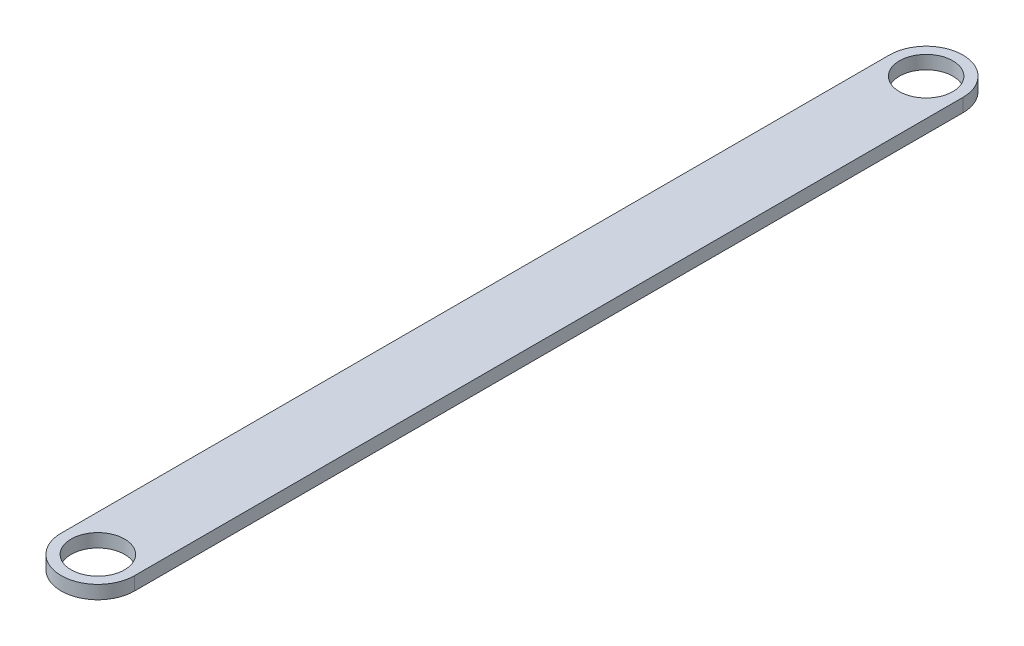
ISO-10303-21;
HEADER;
FILE_DESCRIPTION(('STEP AP214'),'2;1');
FILE_NAME('part.step','',(''),(''),'','','');
FILE_SCHEMA(('AUTOMOTIVE_DESIGN { 1 0 10303 214 1 1 1 1 }'));
ENDSEC;
DATA;
#1=APPLICATION_CONTEXT('core data for automotive mechanical design processes');
#2=APPLICATION_PROTOCOL_DEFINITION('international standard','automotive_design',2000,#1);
#3=PRODUCT_CONTEXT('',#1,'mechanical');
#4=PRODUCT('Part','Part','',(#3));
#5=PRODUCT_RELATED_PRODUCT_CATEGORY('part','',(#4));
#6=PRODUCT_DEFINITION_FORMATION('','',#4);
#7=PRODUCT_DEFINITION_CONTEXT('part definition',#1,'design');
#8=PRODUCT_DEFINITION('design','',#6,#7);
#9=PRODUCT_DEFINITION_SHAPE('','',#8);
#10=(LENGTH_UNIT() NAMED_UNIT(*) SI_UNIT(.MILLI.,.METRE.));
#11=(NAMED_UNIT(*) PLANE_ANGLE_UNIT() SI_UNIT($,.RADIAN.));
#12=(NAMED_UNIT(*) SI_UNIT($,.STERADIAN.) SOLID_ANGLE_UNIT());
#13=UNCERTAINTY_MEASURE_WITH_UNIT(LENGTH_MEASURE(1.E-05),#10,'distance_accuracy_value','');
#14=(GEOMETRIC_REPRESENTATION_CONTEXT(3) GLOBAL_UNCERTAINTY_ASSIGNED_CONTEXT((#13)) GLOBAL_UNIT_ASSIGNED_CONTEXT((#10,
#11,#12)) REPRESENTATION_CONTEXT('',''));
#15=CARTESIAN_POINT('',(0.,0.,0.));
#16=DIRECTION('',(0.,0.,1.));
#17=DIRECTION('',(1.,0.,0.));
#18=AXIS2_PLACEMENT_3D('',#15,#16,#17);
#19=CARTESIAN_POINT('',(0.,2.,0.));
#20=DIRECTION('',(0.,1.,0.));
#21=DIRECTION('',(0.,0.,1.));
#22=AXIS2_PLACEMENT_3D('',#19,#20,#21);
#23=PLANE('',#22);
#24=CARTESIAN_POINT('',(0.,2.,-124.));
#25=DIRECTION('',(0.,1.,0.));
#26=DIRECTION('',(0.,0.,1.));
#27=AXIS2_PLACEMENT_3D('',#24,#25,#26);
#28=CIRCLE('',#27,4.);
#29=CARTESIAN_POINT('',(0.,2.,-120.));
#30=VERTEX_POINT('',#29);
#31=EDGE_CURVE('E106',#30,#30,#28,.T.);
#32=ORIENTED_EDGE('',*,*,#31,.F.);
#33=EDGE_LOOP('',(#32));
#34=FACE_BOUND('',#33,.T.);
#35=CARTESIAN_POINT('',(0.,2.,0.));
#36=DIRECTION('',(0.,1.,0.));
#37=DIRECTION('',(0.,0.,1.));
#38=AXIS2_PLACEMENT_3D('',#35,#36,#37);
#39=CIRCLE('',#38,5.5);
#40=CARTESIAN_POINT('',(-5.5,2.,0.));
#41=VERTEX_POINT('',#40);
#42=CARTESIAN_POINT('',(5.5,2.,0.));
#43=VERTEX_POINT('',#42);
#44=EDGE_CURVE('E91',#41,#43,#39,.T.);
#45=ORIENTED_EDGE('',*,*,#44,.T.);
#46=DIRECTION('',(0.,0.,-1.));
#47=VECTOR('',#46,1.);
#48=CARTESIAN_POINT('',(5.5,2.,0.));
#49=LINE('',#48,#47);
#50=CARTESIAN_POINT('',(5.5,2.,-124.));
#51=VERTEX_POINT('',#50);
#52=EDGE_CURVE('E86',#43,#51,#49,.T.);
#53=ORIENTED_EDGE('',*,*,#52,.T.);
#54=CARTESIAN_POINT('',(0.,2.,-124.));
#55=DIRECTION('',(0.,1.,0.));
#56=DIRECTION('',(0.,0.,1.));
#57=AXIS2_PLACEMENT_3D('',#54,#55,#56);
#58=CIRCLE('',#57,5.5);
#59=CARTESIAN_POINT('',(-5.5,2.,-124.));
#60=VERTEX_POINT('',#59);
#61=EDGE_CURVE('E89',#51,#60,#58,.T.);
#62=ORIENTED_EDGE('',*,*,#61,.T.);
#63=DIRECTION('',(0.,0.,1.));
#64=VECTOR('',#63,1.);
#65=CARTESIAN_POINT('',(-5.5,2.,0.));
#66=LINE('',#65,#64);
#67=EDGE_CURVE('E56',#60,#41,#66,.T.);
#68=ORIENTED_EDGE('',*,*,#67,.T.);
#69=EDGE_LOOP('',(#45,#53,#62,#68));
#70=FACE_BOUND('',#69,.T.);
#71=CARTESIAN_POINT('',(0.,2.,0.));
#72=DIRECTION('',(0.,1.,0.));
#73=DIRECTION('',(0.,0.,1.));
#74=AXIS2_PLACEMENT_3D('',#71,#72,#73);
#75=CIRCLE('',#74,4.);
#76=CARTESIAN_POINT('',(0.,2.,4.));
#77=VERTEX_POINT('',#76);
#78=EDGE_CURVE('E121',#77,#77,#75,.T.);
#79=ORIENTED_EDGE('',*,*,#78,.F.);
#80=EDGE_LOOP('',(#79));
#81=FACE_BOUND('',#80,.T.);
#82=ADVANCED_FACE('F39',(#34,#70,#81),#23,.T.);
#83=CARTESIAN_POINT('',(0.,0.,0.));
#84=DIRECTION('',(0.,1.,0.));
#85=DIRECTION('',(0.,0.,1.));
#86=AXIS2_PLACEMENT_3D('',#83,#84,#85);
#87=PLANE('',#86);
#88=CARTESIAN_POINT('',(0.,0.,0.));
#89=DIRECTION('',(0.,1.,0.));
#90=DIRECTION('',(0.,0.,1.));
#91=AXIS2_PLACEMENT_3D('',#88,#89,#90);
#92=CIRCLE('',#91,5.5);
#93=CARTESIAN_POINT('',(-5.5,0.,0.));
#94=VERTEX_POINT('',#93);
#95=CARTESIAN_POINT('',(5.5,0.,0.));
#96=VERTEX_POINT('',#95);
#97=EDGE_CURVE('E103',#94,#96,#92,.T.);
#98=ORIENTED_EDGE('',*,*,#97,.F.);
#99=DIRECTION('',(0.,0.,1.));
#100=VECTOR('',#99,1.);
#101=CARTESIAN_POINT('',(-5.5,0.,0.));
#102=LINE('',#101,#100);
#103=CARTESIAN_POINT('',(-5.5,0.,-124.));
#104=VERTEX_POINT('',#103);
#105=EDGE_CURVE('E79',#104,#94,#102,.T.);
#106=ORIENTED_EDGE('',*,*,#105,.F.);
#107=CARTESIAN_POINT('',(0.,0.,-124.));
#108=DIRECTION('',(0.,1.,0.));
#109=DIRECTION('',(0.,0.,1.));
#110=AXIS2_PLACEMENT_3D('',#107,#108,#109);
#111=CIRCLE('',#110,5.5);
#112=CARTESIAN_POINT('',(5.5,0.,-124.));
#113=VERTEX_POINT('',#112);
#114=EDGE_CURVE('E73',#113,#104,#111,.T.);
#115=ORIENTED_EDGE('',*,*,#114,.F.);
#116=DIRECTION('',(0.,0.,-1.));
#117=VECTOR('',#116,1.);
#118=CARTESIAN_POINT('',(5.5,0.,0.));
#119=LINE('',#118,#117);
#120=EDGE_CURVE('E95',#96,#113,#119,.T.);
#121=ORIENTED_EDGE('',*,*,#120,.F.);
#122=EDGE_LOOP('',(#98,#106,#115,#121));
#123=FACE_BOUND('',#122,.T.);
#124=CARTESIAN_POINT('',(0.,0.,-124.));
#125=DIRECTION('',(0.,1.,0.));
#126=DIRECTION('',(0.,0.,1.));
#127=AXIS2_PLACEMENT_3D('',#124,#125,#126);
#128=CIRCLE('',#127,4.);
#129=CARTESIAN_POINT('',(0.,0.,-120.));
#130=VERTEX_POINT('',#129);
#131=EDGE_CURVE('E118',#130,#130,#128,.T.);
#132=ORIENTED_EDGE('',*,*,#131,.T.);
#133=EDGE_LOOP('',(#132));
#134=FACE_BOUND('',#133,.T.);
#135=CARTESIAN_POINT('',(0.,0.,0.));
#136=DIRECTION('',(0.,1.,0.));
#137=DIRECTION('',(0.,0.,1.));
#138=AXIS2_PLACEMENT_3D('',#135,#136,#137);
#139=CIRCLE('',#138,4.);
#140=CARTESIAN_POINT('',(0.,0.,4.));
#141=VERTEX_POINT('',#140);
#142=EDGE_CURVE('E124',#141,#141,#139,.T.);
#143=ORIENTED_EDGE('',*,*,#142,.T.);
#144=EDGE_LOOP('',(#143));
#145=FACE_BOUND('',#144,.T.);
#146=ADVANCED_FACE('F114',(#123,#134,#145),#87,.F.);
#147=CARTESIAN_POINT('',(0.,2.,0.));
#148=DIRECTION('',(0.,-1.,0.));
#149=DIRECTION('',(0.,0.,-1.));
#150=AXIS2_PLACEMENT_3D('',#147,#148,#149);
#151=CYLINDRICAL_SURFACE('',#150,5.5);
#152=ORIENTED_EDGE('',*,*,#97,.T.);
#153=DIRECTION('',(0.,-1.,0.));
#154=VECTOR('',#153,1.);
#155=CARTESIAN_POINT('',(5.5,2.,0.));
#156=LINE('',#155,#154);
#157=EDGE_CURVE('E11',#43,#96,#156,.T.);
#158=ORIENTED_EDGE('',*,*,#157,.F.);
#159=ORIENTED_EDGE('',*,*,#44,.F.);
#160=DIRECTION('',(0.,-1.,0.));
#161=VECTOR('',#160,1.);
#162=CARTESIAN_POINT('',(-5.5,2.,0.));
#163=LINE('',#162,#161);
#164=EDGE_CURVE('E99',#41,#94,#163,.T.);
#165=ORIENTED_EDGE('',*,*,#164,.T.);
#166=EDGE_LOOP('',(#152,#158,#159,#165));
#167=FACE_BOUND('',#166,.T.);
#168=ADVANCED_FACE('F41',(#167),#151,.T.);
#169=CARTESIAN_POINT('',(5.5,2.,0.));
#170=DIRECTION('',(-1.,0.,0.));
#171=DIRECTION('',(0.,0.,1.));
#172=AXIS2_PLACEMENT_3D('',#169,#170,#171);
#173=PLANE('',#172);
#174=ORIENTED_EDGE('',*,*,#120,.T.);
#175=DIRECTION('',(0.,-1.,0.));
#176=VECTOR('',#175,1.);
#177=CARTESIAN_POINT('',(5.5,2.,-124.));
#178=LINE('',#177,#176);
#179=EDGE_CURVE('E48',#51,#113,#178,.T.);
#180=ORIENTED_EDGE('',*,*,#179,.F.);
#181=ORIENTED_EDGE('',*,*,#52,.F.);
#182=ORIENTED_EDGE('',*,*,#157,.T.);
#183=EDGE_LOOP('',(#174,#180,#181,#182));
#184=FACE_BOUND('',#183,.T.);
#185=ADVANCED_FACE('F94',(#184),#173,.F.);
#186=CARTESIAN_POINT('',(0.,2.,-124.));
#187=DIRECTION('',(0.,-1.,0.));
#188=DIRECTION('',(0.,0.,-1.));
#189=AXIS2_PLACEMENT_3D('',#186,#187,#188);
#190=CYLINDRICAL_SURFACE('',#189,5.5);
#191=ORIENTED_EDGE('',*,*,#114,.T.);
#192=DIRECTION('',(0.,-1.,0.));
#193=VECTOR('',#192,1.);
#194=CARTESIAN_POINT('',(-5.5,2.,-124.));
#195=LINE('',#194,#193);
#196=EDGE_CURVE('E96',#60,#104,#195,.T.);
#197=ORIENTED_EDGE('',*,*,#196,.F.);
#198=ORIENTED_EDGE('',*,*,#61,.F.);
#199=ORIENTED_EDGE('',*,*,#179,.T.);
#200=EDGE_LOOP('',(#191,#197,#198,#199));
#201=FACE_BOUND('',#200,.T.);
#202=ADVANCED_FACE('F97',(#201),#190,.T.);
#203=CARTESIAN_POINT('',(-5.5,2.,0.));
#204=DIRECTION('',(1.,0.,0.));
#205=DIRECTION('',(0.,0.,-1.));
#206=AXIS2_PLACEMENT_3D('',#203,#204,#205);
#207=PLANE('',#206);
#208=ORIENTED_EDGE('',*,*,#105,.T.);
#209=ORIENTED_EDGE('',*,*,#164,.F.);
#210=ORIENTED_EDGE('',*,*,#67,.F.);
#211=ORIENTED_EDGE('',*,*,#196,.T.);
#212=EDGE_LOOP('',(#208,#209,#210,#211));
#213=FACE_BOUND('',#212,.T.);
#214=ADVANCED_FACE('F111',(#213),#207,.F.);
#215=CARTESIAN_POINT('',(0.,2.,-124.));
#216=DIRECTION('',(0.,-1.,0.));
#217=DIRECTION('',(0.,0.,-1.));
#218=AXIS2_PLACEMENT_3D('',#215,#216,#217);
#219=CYLINDRICAL_SURFACE('',#218,4.);
#220=ORIENTED_EDGE('',*,*,#31,.T.);
#221=EDGE_LOOP('',(#220));
#222=FACE_BOUND('',#221,.T.);
#223=ORIENTED_EDGE('',*,*,#131,.F.);
#224=EDGE_LOOP('',(#223));
#225=FACE_BOUND('',#224,.T.);
#226=ADVANCED_FACE('F141',(#222,#225),#219,.F.);
#227=CARTESIAN_POINT('',(0.,2.,0.));
#228=DIRECTION('',(0.,-1.,0.));
#229=DIRECTION('',(0.,0.,-1.));
#230=AXIS2_PLACEMENT_3D('',#227,#228,#229);
#231=CYLINDRICAL_SURFACE('',#230,4.);
#232=ORIENTED_EDGE('',*,*,#78,.T.);
#233=EDGE_LOOP('',(#232));
#234=FACE_BOUND('',#233,.T.);
#235=ORIENTED_EDGE('',*,*,#142,.F.);
#236=EDGE_LOOP('',(#235));
#237=FACE_BOUND('',#236,.T.);
#238=ADVANCED_FACE('F130',(#234,#237),#231,.F.);
#239=CLOSED_SHELL('',(#82,#146,#168,#185,#202,#214,#226,#238));
#240=MANIFOLD_SOLID_BREP('B2',#239);
#241=ADVANCED_BREP_SHAPE_REPRESENTATION('',(#18,#240),#14);
#242=SHAPE_DEFINITION_REPRESENTATION(#9,#241);
ENDSEC;
END-ISO-10303-21;
